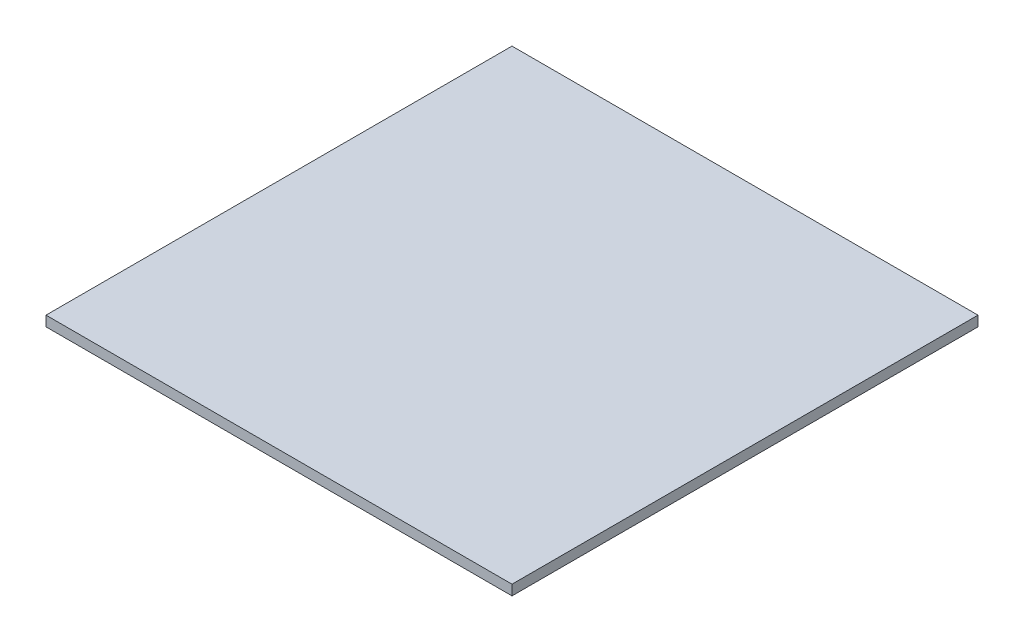
ISO-10303-21;
HEADER;
FILE_DESCRIPTION(('STEP AP214'),'2;1');
FILE_NAME('part.step','',(''),(''),'','','');
FILE_SCHEMA(('AUTOMOTIVE_DESIGN { 1 0 10303 214 1 1 1 1 }'));
ENDSEC;
DATA;
#1=APPLICATION_CONTEXT('core data for automotive mechanical design processes');
#2=APPLICATION_PROTOCOL_DEFINITION('international standard','automotive_design',2000,#1);
#3=PRODUCT_CONTEXT('',#1,'mechanical');
#4=PRODUCT('Part','Part','',(#3));
#5=PRODUCT_RELATED_PRODUCT_CATEGORY('part','',(#4));
#6=PRODUCT_DEFINITION_FORMATION('','',#4);
#7=PRODUCT_DEFINITION_CONTEXT('part definition',#1,'design');
#8=PRODUCT_DEFINITION('design','',#6,#7);
#9=PRODUCT_DEFINITION_SHAPE('','',#8);
#10=(LENGTH_UNIT() NAMED_UNIT(*) SI_UNIT(.MILLI.,.METRE.));
#11=(NAMED_UNIT(*) PLANE_ANGLE_UNIT() SI_UNIT($,.RADIAN.));
#12=(NAMED_UNIT(*) SI_UNIT($,.STERADIAN.) SOLID_ANGLE_UNIT());
#13=UNCERTAINTY_MEASURE_WITH_UNIT(LENGTH_MEASURE(1.E-05),#10,'distance_accuracy_value','');
#14=(GEOMETRIC_REPRESENTATION_CONTEXT(3) GLOBAL_UNCERTAINTY_ASSIGNED_CONTEXT((#13)) GLOBAL_UNIT_ASSIGNED_CONTEXT((#10,
#11,#12)) REPRESENTATION_CONTEXT('',''));
#15=CARTESIAN_POINT('',(0.,0.,0.));
#16=DIRECTION('',(0.,0.,1.));
#17=DIRECTION('',(1.,0.,0.));
#18=AXIS2_PLACEMENT_3D('',#15,#16,#17);
#19=CARTESIAN_POINT('',(-31.5190279113154,6.35963280943233,31.6363637871034));
#20=DIRECTION('',(0.,0.,-1.));
#21=DIRECTION('',(-1.,0.,0.));
#22=AXIS2_PLACEMENT_3D('',#19,#20,#21);
#23=PLANE('',#22);
#24=DIRECTION('',(1.,0.,0.));
#25=VECTOR('',#24,1.);
#26=CARTESIAN_POINT('',(-31.5190279113154,0.,31.6363637871034));
#27=LINE('',#26,#25);
#28=CARTESIAN_POINT('',(-31.5190279113154,0.,31.6363637871034));
#29=VERTEX_POINT('',#28);
#30=CARTESIAN_POINT('',(260.17856152416,0.,31.6363637871034));
#31=VERTEX_POINT('',#30);
#32=EDGE_CURVE('E96',#29,#31,#27,.T.);
#33=ORIENTED_EDGE('',*,*,#32,.T.);
#34=DIRECTION('',(0.,-1.,0.));
#35=VECTOR('',#34,1.);
#36=CARTESIAN_POINT('',(260.17856152416,6.35963280943233,31.6363637871034));
#37=LINE('',#36,#35);
#38=CARTESIAN_POINT('',(260.17856152416,6.35963280943233,31.6363637871034));
#39=VERTEX_POINT('',#38);
#40=EDGE_CURVE('E11',#39,#31,#37,.T.);
#41=ORIENTED_EDGE('',*,*,#40,.F.);
#42=DIRECTION('',(1.,0.,0.));
#43=VECTOR('',#42,1.);
#44=CARTESIAN_POINT('',(-31.5190279113154,6.35963280943233,31.6363637871034));
#45=LINE('',#44,#43);
#46=CARTESIAN_POINT('',(-31.5190279113154,6.35963280943233,31.6363637871034));
#47=VERTEX_POINT('',#46);
#48=EDGE_CURVE('E73',#47,#39,#45,.T.);
#49=ORIENTED_EDGE('',*,*,#48,.F.);
#50=DIRECTION('',(0.,-1.,0.));
#51=VECTOR('',#50,1.);
#52=CARTESIAN_POINT('',(-31.5190279113154,6.35963280943233,31.6363637871034));
#53=LINE('',#52,#51);
#54=EDGE_CURVE('E92',#47,#29,#53,.T.);
#55=ORIENTED_EDGE('',*,*,#54,.T.);
#56=EDGE_LOOP('',(#33,#41,#49,#55));
#57=FACE_BOUND('',#56,.T.);
#58=ADVANCED_FACE('F34',(#57),#23,.F.);
#59=CARTESIAN_POINT('',(260.17856152416,6.35963280943233,-260.051403775776));
#60=DIRECTION('',(1.,0.,0.));
#61=DIRECTION('',(0.,0.,-1.));
#62=AXIS2_PLACEMENT_3D('',#59,#60,#61);
#63=PLANE('',#62);
#64=DIRECTION('',(0.,0.,1.));
#65=VECTOR('',#64,1.);
#66=CARTESIAN_POINT('',(260.17856152416,0.,-260.051403775776));
#67=LINE('',#66,#65);
#68=CARTESIAN_POINT('',(260.17856152416,0.,-260.051403775776));
#69=VERTEX_POINT('',#68);
#70=EDGE_CURVE('E82',#69,#31,#67,.T.);
#71=ORIENTED_EDGE('',*,*,#70,.F.);
#72=DIRECTION('',(0.,-1.,0.));
#73=VECTOR('',#72,1.);
#74=CARTESIAN_POINT('',(260.17856152416,6.35963280943233,-260.051403775776));
#75=LINE('',#74,#73);
#76=CARTESIAN_POINT('',(260.17856152416,6.35963280943233,-260.051403775776));
#77=VERTEX_POINT('',#76);
#78=EDGE_CURVE('E42',#77,#69,#75,.T.);
#79=ORIENTED_EDGE('',*,*,#78,.F.);
#80=DIRECTION('',(0.,0.,1.));
#81=VECTOR('',#80,1.);
#82=CARTESIAN_POINT('',(260.17856152416,6.35963280943233,-260.051403775776));
#83=LINE('',#82,#81);
#84=EDGE_CURVE('E80',#77,#39,#83,.T.);
#85=ORIENTED_EDGE('',*,*,#84,.T.);
#86=ORIENTED_EDGE('',*,*,#40,.T.);
#87=EDGE_LOOP('',(#71,#79,#85,#86));
#88=FACE_BOUND('',#87,.T.);
#89=ADVANCED_FACE('F79',(#88),#63,.T.);
#90=CARTESIAN_POINT('',(-31.5190279113154,6.35963280943233,-260.051403775776));
#91=DIRECTION('',(0.,0.,-1.));
#92=DIRECTION('',(-1.,0.,0.));
#93=AXIS2_PLACEMENT_3D('',#90,#91,#92);
#94=PLANE('',#93);
#95=DIRECTION('',(1.,0.,0.));
#96=VECTOR('',#95,1.);
#97=CARTESIAN_POINT('',(-31.5190279113154,0.,-260.051403775776));
#98=LINE('',#97,#96);
#99=CARTESIAN_POINT('',(-31.5190279113154,0.,-260.051403775776));
#100=VERTEX_POINT('',#99);
#101=EDGE_CURVE('E100',#100,#69,#98,.T.);
#102=ORIENTED_EDGE('',*,*,#101,.F.);
#103=DIRECTION('',(0.,-1.,0.));
#104=VECTOR('',#103,1.);
#105=CARTESIAN_POINT('',(-31.5190279113154,6.35963280943233,-260.051403775776));
#106=LINE('',#105,#104);
#107=CARTESIAN_POINT('',(-31.5190279113154,6.35963280943233,-260.051403775776));
#108=VERTEX_POINT('',#107);
#109=EDGE_CURVE('E65',#108,#100,#106,.T.);
#110=ORIENTED_EDGE('',*,*,#109,.F.);
#111=DIRECTION('',(1.,0.,0.));
#112=VECTOR('',#111,1.);
#113=CARTESIAN_POINT('',(-31.5190279113154,6.35963280943233,-260.051403775776));
#114=LINE('',#113,#112);
#115=EDGE_CURVE('E88',#108,#77,#114,.T.);
#116=ORIENTED_EDGE('',*,*,#115,.T.);
#117=ORIENTED_EDGE('',*,*,#78,.T.);
#118=EDGE_LOOP('',(#102,#110,#116,#117));
#119=FACE_BOUND('',#118,.T.);
#120=ADVANCED_FACE('F90',(#119),#94,.T.);
#121=CARTESIAN_POINT('',(-31.5190279113154,6.35963280943233,-260.051403775776));
#122=DIRECTION('',(1.,0.,0.));
#123=DIRECTION('',(0.,0.,-1.));
#124=AXIS2_PLACEMENT_3D('',#121,#122,#123);
#125=PLANE('',#124);
#126=DIRECTION('',(0.,0.,1.));
#127=VECTOR('',#126,1.);
#128=CARTESIAN_POINT('',(-31.5190279113154,0.,-260.051403775776));
#129=LINE('',#128,#127);
#130=EDGE_CURVE('E68',#100,#29,#129,.T.);
#131=ORIENTED_EDGE('',*,*,#130,.T.);
#132=ORIENTED_EDGE('',*,*,#54,.F.);
#133=DIRECTION('',(0.,0.,1.));
#134=VECTOR('',#133,1.);
#135=CARTESIAN_POINT('',(-31.5190279113154,6.35963280943233,-260.051403775776));
#136=LINE('',#135,#134);
#137=EDGE_CURVE('E50',#108,#47,#136,.T.);
#138=ORIENTED_EDGE('',*,*,#137,.F.);
#139=ORIENTED_EDGE('',*,*,#109,.T.);
#140=EDGE_LOOP('',(#131,#132,#138,#139));
#141=FACE_BOUND('',#140,.T.);
#142=ADVANCED_FACE('F113',(#141),#125,.F.);
#143=CARTESIAN_POINT('',(0.,6.35963280943233,0.));
#144=DIRECTION('',(0.,-1.,0.));
#145=DIRECTION('',(0.,0.,-1.));
#146=AXIS2_PLACEMENT_3D('',#143,#144,#145);
#147=PLANE('',#146);
#148=ORIENTED_EDGE('',*,*,#48,.T.);
#149=ORIENTED_EDGE('',*,*,#84,.F.);
#150=ORIENTED_EDGE('',*,*,#115,.F.);
#151=ORIENTED_EDGE('',*,*,#137,.T.);
#152=EDGE_LOOP('',(#148,#149,#150,#151));
#153=FACE_BOUND('',#152,.T.);
#154=ADVANCED_FACE('F87',(#153),#147,.F.);
#155=CARTESIAN_POINT('',(0.,0.,0.));
#156=DIRECTION('',(0.,-1.,0.));
#157=DIRECTION('',(0.,0.,-1.));
#158=AXIS2_PLACEMENT_3D('',#155,#156,#157);
#159=PLANE('',#158);
#160=ORIENTED_EDGE('',*,*,#32,.F.);
#161=ORIENTED_EDGE('',*,*,#130,.F.);
#162=ORIENTED_EDGE('',*,*,#101,.T.);
#163=ORIENTED_EDGE('',*,*,#70,.T.);
#164=EDGE_LOOP('',(#160,#161,#162,#163));
#165=FACE_BOUND('',#164,.T.);
#166=ADVANCED_FACE('F107',(#165),#159,.T.);
#167=CLOSED_SHELL('',(#58,#89,#120,#142,#154,#166));
#168=MANIFOLD_SOLID_BREP('B2',#167);
#169=ADVANCED_BREP_SHAPE_REPRESENTATION('',(#18,#168),#14);
#170=SHAPE_DEFINITION_REPRESENTATION(#9,#169);
ENDSEC;
END-ISO-10303-21;
